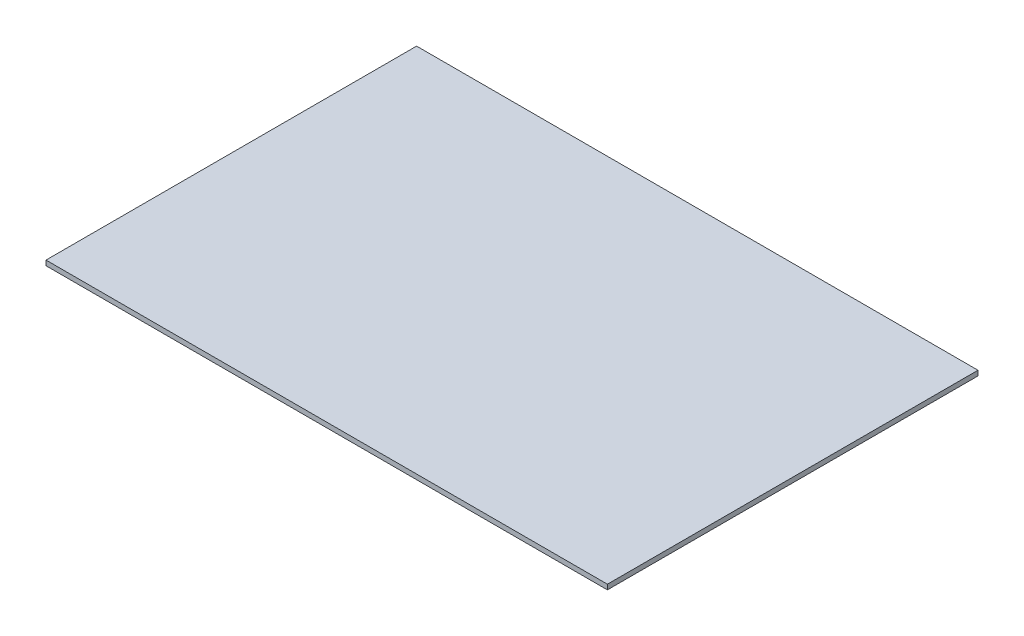
ISO-10303-21;
HEADER;
FILE_DESCRIPTION(('STEP AP214'),'2;1');
FILE_NAME('part.step','',(''),(''),'','','');
FILE_SCHEMA(('AUTOMOTIVE_DESIGN { 1 0 10303 214 1 1 1 1 }'));
ENDSEC;
DATA;
#1=APPLICATION_CONTEXT('core data for automotive mechanical design processes');
#2=APPLICATION_PROTOCOL_DEFINITION('international standard','automotive_design',2000,#1);
#3=PRODUCT_CONTEXT('',#1,'mechanical');
#4=PRODUCT('Part','Part','',(#3));
#5=PRODUCT_RELATED_PRODUCT_CATEGORY('part','',(#4));
#6=PRODUCT_DEFINITION_FORMATION('','',#4);
#7=PRODUCT_DEFINITION_CONTEXT('part definition',#1,'design');
#8=PRODUCT_DEFINITION('design','',#6,#7);
#9=PRODUCT_DEFINITION_SHAPE('','',#8);
#10=(LENGTH_UNIT() NAMED_UNIT(*) SI_UNIT(.MILLI.,.METRE.));
#11=(NAMED_UNIT(*) PLANE_ANGLE_UNIT() SI_UNIT($,.RADIAN.));
#12=(NAMED_UNIT(*) SI_UNIT($,.STERADIAN.) SOLID_ANGLE_UNIT());
#13=UNCERTAINTY_MEASURE_WITH_UNIT(LENGTH_MEASURE(1.E-05),#10,'distance_accuracy_value','');
#14=(GEOMETRIC_REPRESENTATION_CONTEXT(3) GLOBAL_UNCERTAINTY_ASSIGNED_CONTEXT((#13)) GLOBAL_UNIT_ASSIGNED_CONTEXT((#10,
#11,#12)) REPRESENTATION_CONTEXT('',''));
#15=CARTESIAN_POINT('',(0.,0.,0.));
#16=DIRECTION('',(0.,0.,1.));
#17=DIRECTION('',(1.,0.,0.));
#18=AXIS2_PLACEMENT_3D('',#15,#16,#17);
#19=CARTESIAN_POINT('',(0.,0.2,-15.));
#20=DIRECTION('',(1.,0.,0.));
#21=DIRECTION('',(0.,0.,-1.));
#22=AXIS2_PLACEMENT_3D('',#19,#20,#21);
#23=PLANE('',#22);
#24=DIRECTION('',(0.,0.,1.));
#25=VECTOR('',#24,1.);
#26=CARTESIAN_POINT('',(0.,0.,-15.));
#27=LINE('',#26,#25);
#28=CARTESIAN_POINT('',(0.,0.,-15.));
#29=VERTEX_POINT('',#28);
#30=CARTESIAN_POINT('',(0.,0.,0.));
#31=VERTEX_POINT('',#30);
#32=EDGE_CURVE('E102',#29,#31,#27,.T.);
#33=ORIENTED_EDGE('',*,*,#32,.T.);
#34=DIRECTION('',(0.,-1.,0.));
#35=VECTOR('',#34,1.);
#36=CARTESIAN_POINT('',(0.,0.2,0.));
#37=LINE('',#36,#35);
#38=CARTESIAN_POINT('',(0.,0.2,0.));
#39=VERTEX_POINT('',#38);
#40=EDGE_CURVE('E11',#39,#31,#37,.T.);
#41=ORIENTED_EDGE('',*,*,#40,.F.);
#42=DIRECTION('',(0.,0.,1.));
#43=VECTOR('',#42,1.);
#44=CARTESIAN_POINT('',(0.,0.2,-15.));
#45=LINE('',#44,#43);
#46=CARTESIAN_POINT('',(0.,0.2,-15.));
#47=VERTEX_POINT('',#46);
#48=EDGE_CURVE('E90',#47,#39,#45,.T.);
#49=ORIENTED_EDGE('',*,*,#48,.F.);
#50=DIRECTION('',(0.,-1.,0.));
#51=VECTOR('',#50,1.);
#52=CARTESIAN_POINT('',(0.,0.2,-15.));
#53=LINE('',#52,#51);
#54=EDGE_CURVE('E98',#47,#29,#53,.T.);
#55=ORIENTED_EDGE('',*,*,#54,.T.);
#56=EDGE_LOOP('',(#33,#41,#49,#55));
#57=FACE_BOUND('',#56,.T.);
#58=ADVANCED_FACE('F39',(#57),#23,.F.);
#59=CARTESIAN_POINT('',(0.,0.2,0.));
#60=DIRECTION('',(0.,0.,-1.));
#61=DIRECTION('',(-1.,0.,0.));
#62=AXIS2_PLACEMENT_3D('',#59,#60,#61);
#63=PLANE('',#62);
#64=DIRECTION('',(1.,0.,0.));
#65=VECTOR('',#64,1.);
#66=CARTESIAN_POINT('',(0.,0.,0.));
#67=LINE('',#66,#65);
#68=CARTESIAN_POINT('',(22.72371994,0.,0.));
#69=VERTEX_POINT('',#68);
#70=EDGE_CURVE('E94',#31,#69,#67,.T.);
#71=ORIENTED_EDGE('',*,*,#70,.T.);
#72=DIRECTION('',(0.,-1.,0.));
#73=VECTOR('',#72,1.);
#74=CARTESIAN_POINT('',(22.72371994,0.2,0.));
#75=LINE('',#74,#73);
#76=CARTESIAN_POINT('',(22.72371994,0.2,0.));
#77=VERTEX_POINT('',#76);
#78=EDGE_CURVE('E47',#77,#69,#75,.T.);
#79=ORIENTED_EDGE('',*,*,#78,.F.);
#80=DIRECTION('',(1.,0.,0.));
#81=VECTOR('',#80,1.);
#82=CARTESIAN_POINT('',(0.,0.2,0.));
#83=LINE('',#82,#81);
#84=EDGE_CURVE('E85',#39,#77,#83,.T.);
#85=ORIENTED_EDGE('',*,*,#84,.F.);
#86=ORIENTED_EDGE('',*,*,#40,.T.);
#87=EDGE_LOOP('',(#71,#79,#85,#86));
#88=FACE_BOUND('',#87,.T.);
#89=ADVANCED_FACE('F93',(#88),#63,.F.);
#90=CARTESIAN_POINT('',(22.72371994,0.2,0.));
#91=DIRECTION('',(-1.,0.,0.));
#92=DIRECTION('',(0.,0.,1.));
#93=AXIS2_PLACEMENT_3D('',#90,#91,#92);
#94=PLANE('',#93);
#95=DIRECTION('',(0.,0.,-1.));
#96=VECTOR('',#95,1.);
#97=CARTESIAN_POINT('',(22.72371994,0.,0.));
#98=LINE('',#97,#96);
#99=CARTESIAN_POINT('',(22.72371994,0.,-15.));
#100=VERTEX_POINT('',#99);
#101=EDGE_CURVE('E72',#69,#100,#98,.T.);
#102=ORIENTED_EDGE('',*,*,#101,.T.);
#103=DIRECTION('',(0.,-1.,0.));
#104=VECTOR('',#103,1.);
#105=CARTESIAN_POINT('',(22.72371994,0.2,-15.));
#106=LINE('',#105,#104);
#107=CARTESIAN_POINT('',(22.72371994,0.2,-15.));
#108=VERTEX_POINT('',#107);
#109=EDGE_CURVE('E95',#108,#100,#106,.T.);
#110=ORIENTED_EDGE('',*,*,#109,.F.);
#111=DIRECTION('',(0.,0.,-1.));
#112=VECTOR('',#111,1.);
#113=CARTESIAN_POINT('',(22.72371994,0.2,0.));
#114=LINE('',#113,#112);
#115=EDGE_CURVE('E88',#77,#108,#114,.T.);
#116=ORIENTED_EDGE('',*,*,#115,.F.);
#117=ORIENTED_EDGE('',*,*,#78,.T.);
#118=EDGE_LOOP('',(#102,#110,#116,#117));
#119=FACE_BOUND('',#118,.T.);
#120=ADVANCED_FACE('F96',(#119),#94,.F.);
#121=CARTESIAN_POINT('',(22.72371994,0.2,-15.));
#122=DIRECTION('',(0.,0.,1.));
#123=DIRECTION('',(1.,0.,0.));
#124=AXIS2_PLACEMENT_3D('',#121,#122,#123);
#125=PLANE('',#124);
#126=DIRECTION('',(-1.,0.,0.));
#127=VECTOR('',#126,1.);
#128=CARTESIAN_POINT('',(22.72371994,0.,-15.));
#129=LINE('',#128,#127);
#130=EDGE_CURVE('E78',#100,#29,#129,.T.);
#131=ORIENTED_EDGE('',*,*,#130,.T.);
#132=ORIENTED_EDGE('',*,*,#54,.F.);
#133=DIRECTION('',(-1.,0.,0.));
#134=VECTOR('',#133,1.);
#135=CARTESIAN_POINT('',(22.72371994,0.2,-15.));
#136=LINE('',#135,#134);
#137=EDGE_CURVE('E55',#108,#47,#136,.T.);
#138=ORIENTED_EDGE('',*,*,#137,.F.);
#139=ORIENTED_EDGE('',*,*,#109,.T.);
#140=EDGE_LOOP('',(#131,#132,#138,#139));
#141=FACE_BOUND('',#140,.T.);
#142=ADVANCED_FACE('F109',(#141),#125,.F.);
#143=CARTESIAN_POINT('',(0.,0.2,0.));
#144=DIRECTION('',(0.,1.,0.));
#145=DIRECTION('',(0.,0.,1.));
#146=AXIS2_PLACEMENT_3D('',#143,#144,#145);
#147=PLANE('',#146);
#148=ORIENTED_EDGE('',*,*,#48,.T.);
#149=ORIENTED_EDGE('',*,*,#84,.T.);
#150=ORIENTED_EDGE('',*,*,#115,.T.);
#151=ORIENTED_EDGE('',*,*,#137,.T.);
#152=EDGE_LOOP('',(#148,#149,#150,#151));
#153=FACE_BOUND('',#152,.T.);
#154=ADVANCED_FACE('F86',(#153),#147,.T.);
#155=CARTESIAN_POINT('',(0.,0.,0.));
#156=DIRECTION('',(0.,1.,0.));
#157=DIRECTION('',(0.,0.,1.));
#158=AXIS2_PLACEMENT_3D('',#155,#156,#157);
#159=PLANE('',#158);
#160=ORIENTED_EDGE('',*,*,#32,.F.);
#161=ORIENTED_EDGE('',*,*,#130,.F.);
#162=ORIENTED_EDGE('',*,*,#101,.F.);
#163=ORIENTED_EDGE('',*,*,#70,.F.);
#164=EDGE_LOOP('',(#160,#161,#162,#163));
#165=FACE_BOUND('',#164,.T.);
#166=ADVANCED_FACE('F112',(#165),#159,.F.);
#167=CLOSED_SHELL('',(#58,#89,#120,#142,#154,#166));
#168=MANIFOLD_SOLID_BREP('B2',#167);
#169=ADVANCED_BREP_SHAPE_REPRESENTATION('',(#18,#168),#14);
#170=SHAPE_DEFINITION_REPRESENTATION(#9,#169);
ENDSEC;
END-ISO-10303-21;
